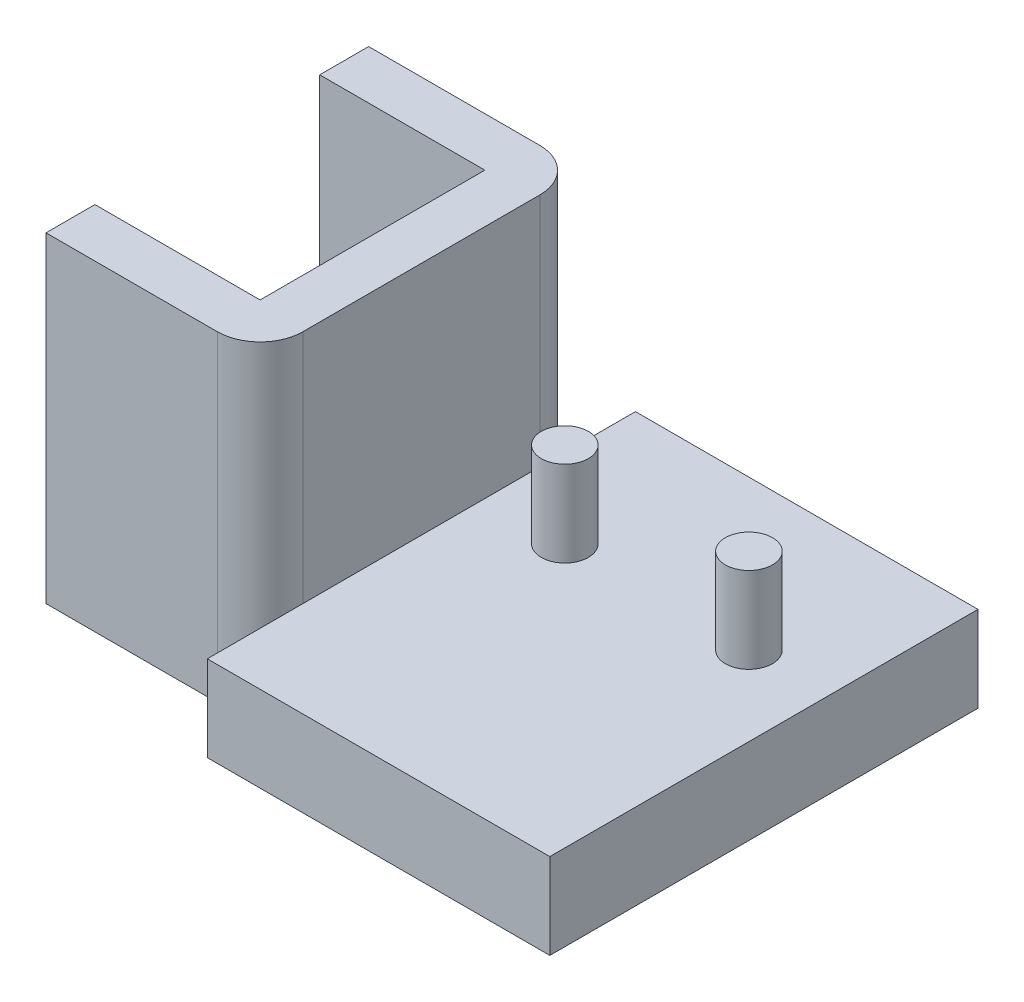
ISO-10303-21;
HEADER;
FILE_DESCRIPTION(('STEP AP214'),'2;1');
FILE_NAME('part.step','',(''),(''),'','','');
FILE_SCHEMA(('AUTOMOTIVE_DESIGN { 1 0 10303 214 1 1 1 1 }'));
ENDSEC;
DATA;
#1=APPLICATION_CONTEXT('core data for automotive mechanical design processes');
#2=APPLICATION_PROTOCOL_DEFINITION('international standard','automotive_design',2000,#1);
#3=PRODUCT_CONTEXT('',#1,'mechanical');
#4=PRODUCT('Part','Part','',(#3));
#5=PRODUCT_RELATED_PRODUCT_CATEGORY('part','',(#4));
#6=PRODUCT_DEFINITION_FORMATION('','',#4);
#7=PRODUCT_DEFINITION_CONTEXT('part definition',#1,'design');
#8=PRODUCT_DEFINITION('design','',#6,#7);
#9=PRODUCT_DEFINITION_SHAPE('','',#8);
#10=(LENGTH_UNIT() NAMED_UNIT(*) SI_UNIT(.MILLI.,.METRE.));
#11=(NAMED_UNIT(*) PLANE_ANGLE_UNIT() SI_UNIT($,.RADIAN.));
#12=(NAMED_UNIT(*) SI_UNIT($,.STERADIAN.) SOLID_ANGLE_UNIT());
#13=UNCERTAINTY_MEASURE_WITH_UNIT(LENGTH_MEASURE(1.E-05),#10,'distance_accuracy_value','');
#14=(GEOMETRIC_REPRESENTATION_CONTEXT(3) GLOBAL_UNCERTAINTY_ASSIGNED_CONTEXT((#13)) GLOBAL_UNIT_ASSIGNED_CONTEXT((#10,
#11,#12)) REPRESENTATION_CONTEXT('',''));
#15=CARTESIAN_POINT('',(0.,0.,0.));
#16=DIRECTION('',(0.,0.,1.));
#17=DIRECTION('',(1.,0.,0.));
#18=AXIS2_PLACEMENT_3D('',#15,#16,#17);
#19=CARTESIAN_POINT('',(3.61645179689281,15.,0.));
#20=DIRECTION('',(-1.,0.,0.));
#21=DIRECTION('',(0.,0.,1.));
#22=AXIS2_PLACEMENT_3D('',#19,#20,#21);
#23=PLANE('',#22);
#24=DIRECTION('',(0.,-1.,0.));
#25=VECTOR('',#24,1.);
#26=CARTESIAN_POINT('',(3.61645179689281,15.,1.20931638920193));
#27=LINE('',#26,#25);
#28=CARTESIAN_POINT('',(3.61645179689281,15.,1.20931638920193));
#29=VERTEX_POINT('',#28);
#30=CARTESIAN_POINT('',(3.61645179689281,4.,1.20931638920193));
#31=VERTEX_POINT('',#30);
#32=EDGE_CURVE('E220',#29,#31,#27,.T.);
#33=ORIENTED_EDGE('',*,*,#32,.T.);
#34=DIRECTION('',(0.,0.,1.));
#35=VECTOR('',#34,1.);
#36=CARTESIAN_POINT('',(3.61645179689282,4.,0.));
#37=LINE('',#36,#35);
#38=CARTESIAN_POINT('',(3.61645179689281,4.,-9.86068361079804));
#39=VERTEX_POINT('',#38);
#40=EDGE_CURVE('E55',#39,#31,#37,.T.);
#41=ORIENTED_EDGE('',*,*,#40,.F.);
#42=DIRECTION('',(0.,-1.,0.));
#43=VECTOR('',#42,1.);
#44=CARTESIAN_POINT('',(3.61645179689281,15.,-9.86068361079804));
#45=LINE('',#44,#43);
#46=CARTESIAN_POINT('',(3.61645179689281,15.,-9.86068361079804));
#47=VERTEX_POINT('',#46);
#48=EDGE_CURVE('E11',#47,#39,#45,.T.);
#49=ORIENTED_EDGE('',*,*,#48,.F.);
#50=DIRECTION('',(0.,0.,-1.));
#51=VECTOR('',#50,1.);
#52=CARTESIAN_POINT('',(3.61645179689281,15.,0.));
#53=LINE('',#52,#51);
#54=EDGE_CURVE('E190',#29,#47,#53,.T.);
#55=ORIENTED_EDGE('',*,*,#54,.F.);
#56=EDGE_LOOP('',(#33,#41,#49,#55));
#57=FACE_BOUND('',#56,.T.);
#58=ADVANCED_FACE('F40',(#57),#23,.F.);
#59=CARTESIAN_POINT('',(1.61645179689281,15.,-9.86068361079806));
#60=DIRECTION('',(0.,-1.,0.));
#61=DIRECTION('',(0.,0.,-1.));
#62=AXIS2_PLACEMENT_3D('',#59,#60,#61);
#63=CYLINDRICAL_SURFACE('',#62,2.);
#64=CARTESIAN_POINT('',(1.61645179689281,0.,-9.86068361079806));
#65=DIRECTION('',(0.,1.,0.));
#66=DIRECTION('',(0.,0.,1.));
#67=AXIS2_PLACEMENT_3D('',#64,#65,#66);
#68=CIRCLE('',#67,2.);
#69=CARTESIAN_POINT('',(3.61645179689282,0.,-9.86068361079804));
#70=VERTEX_POINT('',#69);
#71=CARTESIAN_POINT('',(1.6164517968928,0.,-11.8606836107981));
#72=VERTEX_POINT('',#71);
#73=EDGE_CURVE('E189',#70,#72,#68,.T.);
#74=ORIENTED_EDGE('',*,*,#73,.T.);
#75=DIRECTION('',(0.,-1.,0.));
#76=VECTOR('',#75,1.);
#77=CARTESIAN_POINT('',(1.6164517968928,15.,-11.8606836107981));
#78=LINE('',#77,#76);
#79=CARTESIAN_POINT('',(1.6164517968928,15.,-11.8606836107981));
#80=VERTEX_POINT('',#79);
#81=EDGE_CURVE('E48',#80,#72,#78,.T.);
#82=ORIENTED_EDGE('',*,*,#81,.F.);
#83=CARTESIAN_POINT('',(1.61645179689281,15.,-9.86068361079806));
#84=DIRECTION('',(0.,1.,0.));
#85=DIRECTION('',(0.,0.,1.));
#86=AXIS2_PLACEMENT_3D('',#83,#84,#85);
#87=CIRCLE('',#86,2.);
#88=EDGE_CURVE('E194',#47,#80,#87,.T.);
#89=ORIENTED_EDGE('',*,*,#88,.F.);
#90=ORIENTED_EDGE('',*,*,#48,.T.);
#91=DIRECTION('',(0.,-1.,0.));
#92=VECTOR('',#91,1.);
#93=CARTESIAN_POINT('',(3.61645179689281,15.,-9.86068361079806));
#94=LINE('',#93,#92);
#95=EDGE_CURVE('E180',#39,#70,#94,.T.);
#96=ORIENTED_EDGE('',*,*,#95,.T.);
#97=EDGE_LOOP('',(#74,#82,#89,#90,#96));
#98=FACE_BOUND('',#97,.T.);
#99=ADVANCED_FACE('F301',(#98),#63,.T.);
#100=CARTESIAN_POINT('',(0.,15.,-11.8606836107981));
#101=DIRECTION('',(0.,0.,1.));
#102=DIRECTION('',(1.,0.,0.));
#103=AXIS2_PLACEMENT_3D('',#100,#101,#102);
#104=PLANE('',#103);
#105=DIRECTION('',(-1.,0.,0.));
#106=VECTOR('',#105,1.);
#107=CARTESIAN_POINT('',(0.,0.,-11.8606836107981));
#108=LINE('',#107,#106);
#109=CARTESIAN_POINT('',(-6.38354820310719,0.,-11.8606836107981));
#110=VERTEX_POINT('',#109);
#111=EDGE_CURVE('E223',#72,#110,#108,.T.);
#112=ORIENTED_EDGE('',*,*,#111,.T.);
#113=DIRECTION('',(0.,-1.,0.));
#114=VECTOR('',#113,1.);
#115=CARTESIAN_POINT('',(-6.38354820310719,15.,-11.8606836107981));
#116=LINE('',#115,#114);
#117=CARTESIAN_POINT('',(-6.38354820310719,15.,-11.8606836107981));
#118=VERTEX_POINT('',#117);
#119=EDGE_CURVE('E270',#118,#110,#116,.T.);
#120=ORIENTED_EDGE('',*,*,#119,.F.);
#121=DIRECTION('',(-1.,0.,0.));
#122=VECTOR('',#121,1.);
#123=CARTESIAN_POINT('',(0.,15.,-11.8606836107981));
#124=LINE('',#123,#122);
#125=EDGE_CURVE('E198',#80,#118,#124,.T.);
#126=ORIENTED_EDGE('',*,*,#125,.F.);
#127=ORIENTED_EDGE('',*,*,#81,.T.);
#128=EDGE_LOOP('',(#112,#120,#126,#127));
#129=FACE_BOUND('',#128,.T.);
#130=ADVANCED_FACE('F279',(#129),#104,.F.);
#131=CARTESIAN_POINT('',(-6.38354820310719,15.,0.));
#132=DIRECTION('',(1.,0.,0.));
#133=DIRECTION('',(0.,0.,-1.));
#134=AXIS2_PLACEMENT_3D('',#131,#132,#133);
#135=PLANE('',#134);
#136=DIRECTION('',(0.,0.,1.));
#137=VECTOR('',#136,1.);
#138=CARTESIAN_POINT('',(-6.38354820310719,0.,0.));
#139=LINE('',#138,#137);
#140=CARTESIAN_POINT('',(-6.38354820310719,0.,-9.57568361079805));
#141=VERTEX_POINT('',#140);
#142=EDGE_CURVE('E226',#110,#141,#139,.T.);
#143=ORIENTED_EDGE('',*,*,#142,.T.);
#144=DIRECTION('',(0.,-1.,0.));
#145=VECTOR('',#144,1.);
#146=CARTESIAN_POINT('',(-6.38354820310719,15.,-9.57568361079805));
#147=LINE('',#146,#145);
#148=CARTESIAN_POINT('',(-6.38354820310719,15.,-9.57568361079805));
#149=VERTEX_POINT('',#148);
#150=EDGE_CURVE('E266',#149,#141,#147,.T.);
#151=ORIENTED_EDGE('',*,*,#150,.F.);
#152=DIRECTION('',(0.,0.,1.));
#153=VECTOR('',#152,1.);
#154=CARTESIAN_POINT('',(-6.38354820310719,15.,0.));
#155=LINE('',#154,#153);
#156=EDGE_CURVE('E201',#118,#149,#155,.T.);
#157=ORIENTED_EDGE('',*,*,#156,.F.);
#158=ORIENTED_EDGE('',*,*,#119,.T.);
#159=EDGE_LOOP('',(#143,#151,#157,#158));
#160=FACE_BOUND('',#159,.T.);
#161=ADVANCED_FACE('F290',(#160),#135,.F.);
#162=CARTESIAN_POINT('',(0.,15.,-9.57568361079805));
#163=DIRECTION('',(0.,0.,-1.));
#164=DIRECTION('',(-1.,0.,0.));
#165=AXIS2_PLACEMENT_3D('',#162,#163,#164);
#166=PLANE('',#165);
#167=DIRECTION('',(1.,0.,0.));
#168=VECTOR('',#167,1.);
#169=CARTESIAN_POINT('',(0.,0.,-9.57568361079805));
#170=LINE('',#169,#168);
#171=CARTESIAN_POINT('',(1.3314517968928,0.,-9.57568361079805));
#172=VERTEX_POINT('',#171);
#173=EDGE_CURVE('E229',#141,#172,#170,.T.);
#174=ORIENTED_EDGE('',*,*,#173,.T.);
#175=DIRECTION('',(0.,-1.,0.));
#176=VECTOR('',#175,1.);
#177=CARTESIAN_POINT('',(1.3314517968928,15.,-9.57568361079805));
#178=LINE('',#177,#176);
#179=CARTESIAN_POINT('',(1.3314517968928,15.,-9.57568361079805));
#180=VERTEX_POINT('',#179);
#181=EDGE_CURVE('E262',#180,#172,#178,.T.);
#182=ORIENTED_EDGE('',*,*,#181,.F.);
#183=DIRECTION('',(1.,0.,0.));
#184=VECTOR('',#183,1.);
#185=CARTESIAN_POINT('',(0.,15.,-9.57568361079805));
#186=LINE('',#185,#184);
#187=EDGE_CURVE('E204',#149,#180,#186,.T.);
#188=ORIENTED_EDGE('',*,*,#187,.F.);
#189=ORIENTED_EDGE('',*,*,#150,.T.);
#190=EDGE_LOOP('',(#174,#182,#188,#189));
#191=FACE_BOUND('',#190,.T.);
#192=ADVANCED_FACE('F294',(#191),#166,.F.);
#193=CARTESIAN_POINT('',(1.3314517968928,15.,0.));
#194=DIRECTION('',(1.,0.,0.));
#195=DIRECTION('',(0.,0.,-1.));
#196=AXIS2_PLACEMENT_3D('',#193,#194,#195);
#197=PLANE('',#196);
#198=DIRECTION('',(0.,0.,1.));
#199=VECTOR('',#198,1.);
#200=CARTESIAN_POINT('',(1.3314517968928,0.,0.));
#201=LINE('',#200,#199);
#202=CARTESIAN_POINT('',(1.3314517968928,0.,0.924316389201944));
#203=VERTEX_POINT('',#202);
#204=EDGE_CURVE('E233',#172,#203,#201,.T.);
#205=ORIENTED_EDGE('',*,*,#204,.T.);
#206=DIRECTION('',(0.,-1.,0.));
#207=VECTOR('',#206,1.);
#208=CARTESIAN_POINT('',(1.3314517968928,15.,0.924316389201944));
#209=LINE('',#208,#207);
#210=CARTESIAN_POINT('',(1.3314517968928,15.,0.924316389201944));
#211=VERTEX_POINT('',#210);
#212=EDGE_CURVE('E258',#211,#203,#209,.T.);
#213=ORIENTED_EDGE('',*,*,#212,.F.);
#214=DIRECTION('',(0.,0.,1.));
#215=VECTOR('',#214,1.);
#216=CARTESIAN_POINT('',(1.3314517968928,15.,0.));
#217=LINE('',#216,#215);
#218=EDGE_CURVE('E208',#180,#211,#217,.T.);
#219=ORIENTED_EDGE('',*,*,#218,.F.);
#220=ORIENTED_EDGE('',*,*,#181,.T.);
#221=EDGE_LOOP('',(#205,#213,#219,#220));
#222=FACE_BOUND('',#221,.T.);
#223=ADVANCED_FACE('F405',(#222),#197,.F.);
#224=CARTESIAN_POINT('',(0.,15.,0.924316389201944));
#225=DIRECTION('',(0.,0.,1.));
#226=DIRECTION('',(1.,0.,0.));
#227=AXIS2_PLACEMENT_3D('',#224,#225,#226);
#228=PLANE('',#227);
#229=DIRECTION('',(-1.,0.,0.));
#230=VECTOR('',#229,1.);
#231=CARTESIAN_POINT('',(0.,0.,0.924316389201944));
#232=LINE('',#231,#230);
#233=CARTESIAN_POINT('',(-6.38354820310719,0.,0.924316389201945));
#234=VERTEX_POINT('',#233);
#235=EDGE_CURVE('E236',#203,#234,#232,.T.);
#236=ORIENTED_EDGE('',*,*,#235,.T.);
#237=DIRECTION('',(0.,-1.,0.));
#238=VECTOR('',#237,1.);
#239=CARTESIAN_POINT('',(-6.38354820310719,15.,0.924316389201945));
#240=LINE('',#239,#238);
#241=CARTESIAN_POINT('',(-6.38354820310719,15.,0.924316389201945));
#242=VERTEX_POINT('',#241);
#243=EDGE_CURVE('E254',#242,#234,#240,.T.);
#244=ORIENTED_EDGE('',*,*,#243,.F.);
#245=DIRECTION('',(-1.,0.,0.));
#246=VECTOR('',#245,1.);
#247=CARTESIAN_POINT('',(0.,15.,0.924316389201944));
#248=LINE('',#247,#246);
#249=EDGE_CURVE('E211',#211,#242,#248,.T.);
#250=ORIENTED_EDGE('',*,*,#249,.F.);
#251=ORIENTED_EDGE('',*,*,#212,.T.);
#252=EDGE_LOOP('',(#236,#244,#250,#251));
#253=FACE_BOUND('',#252,.T.);
#254=ADVANCED_FACE('F403',(#253),#228,.F.);
#255=CARTESIAN_POINT('',(-6.38354820310719,0.,3.20931638920194));
#256=VERTEX_POINT('',#255);
#257=EDGE_CURVE('E230',#234,#256,#139,.T.);
#258=ORIENTED_EDGE('',*,*,#257,.T.);
#259=DIRECTION('',(0.,-1.,0.));
#260=VECTOR('',#259,1.);
#261=CARTESIAN_POINT('',(-6.38354820310719,15.,3.20931638920194));
#262=LINE('',#261,#260);
#263=CARTESIAN_POINT('',(-6.38354820310719,15.,3.20931638920194));
#264=VERTEX_POINT('',#263);
#265=EDGE_CURVE('E250',#264,#256,#262,.T.);
#266=ORIENTED_EDGE('',*,*,#265,.F.);
#267=EDGE_CURVE('E205',#242,#264,#155,.T.);
#268=ORIENTED_EDGE('',*,*,#267,.F.);
#269=ORIENTED_EDGE('',*,*,#243,.T.);
#270=EDGE_LOOP('',(#258,#266,#268,#269));
#271=FACE_BOUND('',#270,.T.);
#272=ADVANCED_FACE('F399',(#271),#135,.F.);
#273=CARTESIAN_POINT('',(0.,15.,3.20931638920194));
#274=DIRECTION('',(0.,0.,-1.));
#275=DIRECTION('',(-1.,0.,0.));
#276=AXIS2_PLACEMENT_3D('',#273,#274,#275);
#277=PLANE('',#276);
#278=DIRECTION('',(1.,0.,0.));
#279=VECTOR('',#278,1.);
#280=CARTESIAN_POINT('',(0.,0.,3.20931638920194));
#281=LINE('',#280,#279);
#282=CARTESIAN_POINT('',(1.6164517968928,0.,3.20931638920194));
#283=VERTEX_POINT('',#282);
#284=EDGE_CURVE('E239',#256,#283,#281,.T.);
#285=ORIENTED_EDGE('',*,*,#284,.T.);
#286=DIRECTION('',(0.,-1.,0.));
#287=VECTOR('',#286,1.);
#288=CARTESIAN_POINT('',(1.6164517968928,15.,3.20931638920194));
#289=LINE('',#288,#287);
#290=CARTESIAN_POINT('',(1.6164517968928,15.,3.20931638920194));
#291=VERTEX_POINT('',#290);
#292=EDGE_CURVE('E246',#291,#283,#289,.T.);
#293=ORIENTED_EDGE('',*,*,#292,.F.);
#294=DIRECTION('',(1.,0.,0.));
#295=VECTOR('',#294,1.);
#296=CARTESIAN_POINT('',(0.,15.,3.20931638920194));
#297=LINE('',#296,#295);
#298=EDGE_CURVE('E214',#264,#291,#297,.T.);
#299=ORIENTED_EDGE('',*,*,#298,.F.);
#300=ORIENTED_EDGE('',*,*,#265,.T.);
#301=EDGE_LOOP('',(#285,#293,#299,#300));
#302=FACE_BOUND('',#301,.T.);
#303=ADVANCED_FACE('F391',(#302),#277,.F.);
#304=CARTESIAN_POINT('',(1.61645179689281,15.,1.20931638920194));
#305=DIRECTION('',(0.,-1.,0.));
#306=DIRECTION('',(0.,0.,-1.));
#307=AXIS2_PLACEMENT_3D('',#304,#305,#306);
#308=CYLINDRICAL_SURFACE('',#307,2.);
#309=CARTESIAN_POINT('',(1.61645179689281,0.,1.20931638920194));
#310=DIRECTION('',(0.,1.,0.));
#311=DIRECTION('',(0.,0.,1.));
#312=AXIS2_PLACEMENT_3D('',#309,#310,#311);
#313=CIRCLE('',#312,2.);
#314=CARTESIAN_POINT('',(3.61645179689281,0.,1.20931638920193));
#315=VERTEX_POINT('',#314);
#316=EDGE_CURVE('E195',#283,#315,#313,.T.);
#317=ORIENTED_EDGE('',*,*,#316,.T.);
#318=DIRECTION('',(0.,-1.,0.));
#319=VECTOR('',#318,1.);
#320=CARTESIAN_POINT('',(3.61645179689281,15.,1.20931638920194));
#321=LINE('',#320,#319);
#322=EDGE_CURVE('E62',#31,#315,#321,.T.);
#323=ORIENTED_EDGE('',*,*,#322,.F.);
#324=ORIENTED_EDGE('',*,*,#32,.F.);
#325=CARTESIAN_POINT('',(1.61645179689281,15.,1.20931638920194));
#326=DIRECTION('',(0.,1.,0.));
#327=DIRECTION('',(0.,0.,1.));
#328=AXIS2_PLACEMENT_3D('',#325,#326,#327);
#329=CIRCLE('',#328,2.);
#330=EDGE_CURVE('E217',#291,#29,#329,.T.);
#331=ORIENTED_EDGE('',*,*,#330,.F.);
#332=ORIENTED_EDGE('',*,*,#292,.T.);
#333=EDGE_LOOP('',(#317,#323,#324,#331,#332));
#334=FACE_BOUND('',#333,.T.);
#335=ADVANCED_FACE('F384',(#334),#308,.T.);
#336=CARTESIAN_POINT('',(0.,15.,0.));
#337=DIRECTION('',(0.,1.,0.));
#338=DIRECTION('',(0.,0.,1.));
#339=AXIS2_PLACEMENT_3D('',#336,#337,#338);
#340=PLANE('',#339);
#341=ORIENTED_EDGE('',*,*,#54,.T.);
#342=ORIENTED_EDGE('',*,*,#88,.T.);
#343=ORIENTED_EDGE('',*,*,#125,.T.);
#344=ORIENTED_EDGE('',*,*,#156,.T.);
#345=ORIENTED_EDGE('',*,*,#187,.T.);
#346=ORIENTED_EDGE('',*,*,#218,.T.);
#347=ORIENTED_EDGE('',*,*,#249,.T.);
#348=ORIENTED_EDGE('',*,*,#267,.T.);
#349=ORIENTED_EDGE('',*,*,#298,.T.);
#350=ORIENTED_EDGE('',*,*,#330,.T.);
#351=EDGE_LOOP('',(#341,#342,#343,#344,#345,#346,#347,#348,#349,#350));
#352=FACE_BOUND('',#351,.T.);
#353=ADVANCED_FACE('F298',(#352),#340,.T.);
#354=CARTESIAN_POINT('',(0.,0.,0.));
#355=DIRECTION('',(0.,1.,0.));
#356=DIRECTION('',(0.,0.,1.));
#357=AXIS2_PLACEMENT_3D('',#354,#355,#356);
#358=PLANE('',#357);
#359=ORIENTED_EDGE('',*,*,#73,.F.);
#360=DIRECTION('',(0.,0.,1.));
#361=VECTOR('',#360,1.);
#362=CARTESIAN_POINT('',(3.61645179689282,0.,0.));
#363=LINE('',#362,#361);
#364=CARTESIAN_POINT('',(3.61645179689282,0.,-14.3256836107981));
#365=VERTEX_POINT('',#364);
#366=EDGE_CURVE('E307',#365,#70,#363,.T.);
#367=ORIENTED_EDGE('',*,*,#366,.F.);
#368=DIRECTION('',(-1.,0.,0.));
#369=VECTOR('',#368,1.);
#370=CARTESIAN_POINT('',(0.,0.,-14.3256836107981));
#371=LINE('',#370,#369);
#372=CARTESIAN_POINT('',(19.6164517968928,0.,-14.3256836107981));
#373=VERTEX_POINT('',#372);
#374=EDGE_CURVE('E333',#373,#365,#371,.T.);
#375=ORIENTED_EDGE('',*,*,#374,.F.);
#376=DIRECTION('',(0.,0.,-1.));
#377=VECTOR('',#376,1.);
#378=CARTESIAN_POINT('',(19.6164517968928,0.,0.));
#379=LINE('',#378,#377);
#380=CARTESIAN_POINT('',(19.6164517968928,0.,5.67431638920194));
#381=VERTEX_POINT('',#380);
#382=EDGE_CURVE('E175',#381,#373,#379,.T.);
#383=ORIENTED_EDGE('',*,*,#382,.F.);
#384=DIRECTION('',(1.,0.,0.));
#385=VECTOR('',#384,1.);
#386=CARTESIAN_POINT('',(0.,0.,5.67431638920194));
#387=LINE('',#386,#385);
#388=CARTESIAN_POINT('',(3.61645179689282,0.,5.67431638920194));
#389=VERTEX_POINT('',#388);
#390=EDGE_CURVE('E171',#389,#381,#387,.T.);
#391=ORIENTED_EDGE('',*,*,#390,.F.);
#392=EDGE_CURVE('E321',#315,#389,#363,.T.);
#393=ORIENTED_EDGE('',*,*,#392,.F.);
#394=ORIENTED_EDGE('',*,*,#316,.F.);
#395=ORIENTED_EDGE('',*,*,#284,.F.);
#396=ORIENTED_EDGE('',*,*,#257,.F.);
#397=ORIENTED_EDGE('',*,*,#235,.F.);
#398=ORIENTED_EDGE('',*,*,#204,.F.);
#399=ORIENTED_EDGE('',*,*,#173,.F.);
#400=ORIENTED_EDGE('',*,*,#142,.F.);
#401=ORIENTED_EDGE('',*,*,#111,.F.);
#402=EDGE_LOOP('',(#359,#367,#375,#383,#391,#393,#394,#395,#396,#397,#398,#399,#400,#401));
#403=FACE_BOUND('',#402,.T.);
#404=ADVANCED_FACE('F284',(#403),#358,.F.);
#405=CARTESIAN_POINT('',(3.61645179689282,4.,0.));
#406=DIRECTION('',(1.,0.,0.));
#407=DIRECTION('',(0.,0.,-1.));
#408=AXIS2_PLACEMENT_3D('',#405,#406,#407);
#409=PLANE('',#408);
#410=CARTESIAN_POINT('',(3.61645179689282,4.,5.67431638920194));
#411=VERTEX_POINT('',#410);
#412=EDGE_CURVE('E160',#31,#411,#37,.T.);
#413=ORIENTED_EDGE('',*,*,#412,.F.);
#414=ORIENTED_EDGE('',*,*,#322,.T.);
#415=ORIENTED_EDGE('',*,*,#392,.T.);
#416=DIRECTION('',(0.,-1.,0.));
#417=VECTOR('',#416,1.);
#418=CARTESIAN_POINT('',(3.61645179689282,4.,5.67431638920194));
#419=LINE('',#418,#417);
#420=EDGE_CURVE('E182',#411,#389,#419,.T.);
#421=ORIENTED_EDGE('',*,*,#420,.F.);
#422=EDGE_LOOP('',(#413,#414,#415,#421));
#423=FACE_BOUND('',#422,.T.);
#424=ADVANCED_FACE('F319',(#423),#409,.F.);
#425=CARTESIAN_POINT('',(19.6164517968928,4.,0.));
#426=DIRECTION('',(-1.,0.,0.));
#427=DIRECTION('',(0.,0.,1.));
#428=AXIS2_PLACEMENT_3D('',#425,#426,#427);
#429=PLANE('',#428);
#430=ORIENTED_EDGE('',*,*,#382,.T.);
#431=DIRECTION('',(0.,-1.,0.));
#432=VECTOR('',#431,1.);
#433=CARTESIAN_POINT('',(19.6164517968928,4.,-14.3256836107981));
#434=LINE('',#433,#432);
#435=CARTESIAN_POINT('',(19.6164517968928,4.,-14.3256836107981));
#436=VERTEX_POINT('',#435);
#437=EDGE_CURVE('E152',#436,#373,#434,.T.);
#438=ORIENTED_EDGE('',*,*,#437,.F.);
#439=DIRECTION('',(0.,0.,-1.));
#440=VECTOR('',#439,1.);
#441=CARTESIAN_POINT('',(19.6164517968928,4.,0.));
#442=LINE('',#441,#440);
#443=CARTESIAN_POINT('',(19.6164517968928,4.,5.67431638920194));
#444=VERTEX_POINT('',#443);
#445=EDGE_CURVE('E161',#444,#436,#442,.T.);
#446=ORIENTED_EDGE('',*,*,#445,.F.);
#447=DIRECTION('',(0.,-1.,0.));
#448=VECTOR('',#447,1.);
#449=CARTESIAN_POINT('',(19.6164517968928,4.,5.67431638920194));
#450=LINE('',#449,#448);
#451=EDGE_CURVE('E312',#444,#381,#450,.T.);
#452=ORIENTED_EDGE('',*,*,#451,.T.);
#453=EDGE_LOOP('',(#430,#438,#446,#452));
#454=FACE_BOUND('',#453,.T.);
#455=ADVANCED_FACE('F173',(#454),#429,.F.);
#456=CARTESIAN_POINT('',(0.,4.,-14.3256836107981));
#457=DIRECTION('',(0.,0.,1.));
#458=DIRECTION('',(1.,0.,0.));
#459=AXIS2_PLACEMENT_3D('',#456,#457,#458);
#460=PLANE('',#459);
#461=ORIENTED_EDGE('',*,*,#374,.T.);
#462=DIRECTION('',(0.,-1.,0.));
#463=VECTOR('',#462,1.);
#464=CARTESIAN_POINT('',(3.61645179689282,4.,-14.3256836107981));
#465=LINE('',#464,#463);
#466=CARTESIAN_POINT('',(3.61645179689282,4.,-14.3256836107981));
#467=VERTEX_POINT('',#466);
#468=EDGE_CURVE('E155',#467,#365,#465,.T.);
#469=ORIENTED_EDGE('',*,*,#468,.F.);
#470=DIRECTION('',(-1.,0.,0.));
#471=VECTOR('',#470,1.);
#472=CARTESIAN_POINT('',(0.,4.,-14.3256836107981));
#473=LINE('',#472,#471);
#474=EDGE_CURVE('E148',#436,#467,#473,.T.);
#475=ORIENTED_EDGE('',*,*,#474,.F.);
#476=ORIENTED_EDGE('',*,*,#437,.T.);
#477=EDGE_LOOP('',(#461,#469,#475,#476));
#478=FACE_BOUND('',#477,.T.);
#479=ADVANCED_FACE('F150',(#478),#460,.F.);
#480=ORIENTED_EDGE('',*,*,#95,.F.);
#481=EDGE_CURVE('E306',#467,#39,#37,.T.);
#482=ORIENTED_EDGE('',*,*,#481,.F.);
#483=ORIENTED_EDGE('',*,*,#468,.T.);
#484=ORIENTED_EDGE('',*,*,#366,.T.);
#485=EDGE_LOOP('',(#480,#482,#483,#484));
#486=FACE_BOUND('',#485,.T.);
#487=ADVANCED_FACE('F305',(#486),#409,.F.);
#488=CARTESIAN_POINT('',(0.,4.,5.67431638920194));
#489=DIRECTION('',(0.,0.,-1.));
#490=DIRECTION('',(-1.,0.,0.));
#491=AXIS2_PLACEMENT_3D('',#488,#489,#490);
#492=PLANE('',#491);
#493=ORIENTED_EDGE('',*,*,#390,.T.);
#494=ORIENTED_EDGE('',*,*,#451,.F.);
#495=DIRECTION('',(1.,0.,0.));
#496=VECTOR('',#495,1.);
#497=CARTESIAN_POINT('',(0.,4.,5.67431638920194));
#498=LINE('',#497,#496);
#499=EDGE_CURVE('E166',#411,#444,#498,.T.);
#500=ORIENTED_EDGE('',*,*,#499,.F.);
#501=ORIENTED_EDGE('',*,*,#420,.T.);
#502=EDGE_LOOP('',(#493,#494,#500,#501));
#503=FACE_BOUND('',#502,.T.);
#504=ADVANCED_FACE('F325',(#503),#492,.F.);
#505=CARTESIAN_POINT('',(0.,4.,0.));
#506=DIRECTION('',(0.,1.,0.));
#507=DIRECTION('',(0.,0.,1.));
#508=AXIS2_PLACEMENT_3D('',#505,#506,#507);
#509=PLANE('',#508);
#510=CARTESIAN_POINT('',(15.9164517968928,4.,-7.32568361079806));
#511=DIRECTION('',(0.,1.,0.));
#512=DIRECTION('',(0.,0.,1.));
#513=AXIS2_PLACEMENT_3D('',#510,#511,#512);
#514=CIRCLE('',#513,1.1);
#515=CARTESIAN_POINT('',(15.9164517968928,4.,-6.22568361079806));
#516=VERTEX_POINT('',#515);
#517=EDGE_CURVE('E349',#516,#516,#514,.T.);
#518=ORIENTED_EDGE('',*,*,#517,.F.);
#519=EDGE_LOOP('',(#518));
#520=FACE_BOUND('',#519,.T.);
#521=CARTESIAN_POINT('',(7.31645179689282,4.,-7.32568361079806));
#522=DIRECTION('',(0.,1.,0.));
#523=DIRECTION('',(0.,0.,1.));
#524=AXIS2_PLACEMENT_3D('',#521,#522,#523);
#525=CIRCLE('',#524,1.1);
#526=CARTESIAN_POINT('',(7.31645179689282,4.,-6.22568361079806));
#527=VERTEX_POINT('',#526);
#528=EDGE_CURVE('E340',#527,#527,#525,.T.);
#529=ORIENTED_EDGE('',*,*,#528,.F.);
#530=EDGE_LOOP('',(#529));
#531=FACE_BOUND('',#530,.T.);
#532=ORIENTED_EDGE('',*,*,#445,.T.);
#533=ORIENTED_EDGE('',*,*,#474,.T.);
#534=ORIENTED_EDGE('',*,*,#481,.T.);
#535=ORIENTED_EDGE('',*,*,#40,.T.);
#536=ORIENTED_EDGE('',*,*,#412,.T.);
#537=ORIENTED_EDGE('',*,*,#499,.T.);
#538=EDGE_LOOP('',(#532,#533,#534,#535,#536,#537));
#539=FACE_BOUND('',#538,.T.);
#540=ADVANCED_FACE('F164',(#520,#531,#539),#509,.T.);
#541=CARTESIAN_POINT('',(7.31645179689282,8.,-7.32568361079806));
#542=DIRECTION('',(0.,-1.,0.));
#543=DIRECTION('',(0.,0.,-1.));
#544=AXIS2_PLACEMENT_3D('',#541,#542,#543);
#545=CYLINDRICAL_SURFACE('',#544,1.1);
#546=CARTESIAN_POINT('',(7.31645179689282,8.,-7.32568361079806));
#547=DIRECTION('',(0.,1.,0.));
#548=DIRECTION('',(0.,0.,1.));
#549=AXIS2_PLACEMENT_3D('',#546,#547,#548);
#550=CIRCLE('',#549,1.1);
#551=CARTESIAN_POINT('',(7.31645179689282,8.,-6.22568361079806));
#552=VERTEX_POINT('',#551);
#553=EDGE_CURVE('E337',#552,#552,#550,.T.);
#554=ORIENTED_EDGE('',*,*,#553,.F.);
#555=EDGE_LOOP('',(#554));
#556=FACE_BOUND('',#555,.T.);
#557=ORIENTED_EDGE('',*,*,#528,.T.);
#558=EDGE_LOOP('',(#557));
#559=FACE_BOUND('',#558,.T.);
#560=ADVANCED_FACE('F368',(#556,#559),#545,.T.);
#561=CARTESIAN_POINT('',(7.31645179689282,8.,-7.32568361079806));
#562=DIRECTION('',(0.,1.,0.));
#563=DIRECTION('',(0.,0.,1.));
#564=AXIS2_PLACEMENT_3D('',#561,#562,#563);
#565=PLANE('',#564);
#566=ORIENTED_EDGE('',*,*,#553,.T.);
#567=EDGE_LOOP('',(#566));
#568=FACE_BOUND('',#567,.T.);
#569=ADVANCED_FACE('F362',(#568),#565,.T.);
#570=CARTESIAN_POINT('',(15.9164517968928,8.,-7.32568361079806));
#571=DIRECTION('',(0.,-1.,0.));
#572=DIRECTION('',(0.,0.,-1.));
#573=AXIS2_PLACEMENT_3D('',#570,#571,#572);
#574=CYLINDRICAL_SURFACE('',#573,1.1);
#575=CARTESIAN_POINT('',(15.9164517968928,8.,-7.32568361079806));
#576=DIRECTION('',(0.,1.,0.));
#577=DIRECTION('',(0.,0.,1.));
#578=AXIS2_PLACEMENT_3D('',#575,#576,#577);
#579=CIRCLE('',#578,1.1);
#580=CARTESIAN_POINT('',(15.9164517968928,8.,-6.22568361079806));
#581=VERTEX_POINT('',#580);
#582=EDGE_CURVE('E346',#581,#581,#579,.T.);
#583=ORIENTED_EDGE('',*,*,#582,.F.);
#584=EDGE_LOOP('',(#583));
#585=FACE_BOUND('',#584,.T.);
#586=ORIENTED_EDGE('',*,*,#517,.T.);
#587=EDGE_LOOP('',(#586));
#588=FACE_BOUND('',#587,.T.);
#589=ADVANCED_FACE('F359',(#585,#588),#574,.T.);
#590=CARTESIAN_POINT('',(15.9164517968928,8.,-7.32568361079806));
#591=DIRECTION('',(0.,1.,0.));
#592=DIRECTION('',(0.,0.,1.));
#593=AXIS2_PLACEMENT_3D('',#590,#591,#592);
#594=PLANE('',#593);
#595=ORIENTED_EDGE('',*,*,#582,.T.);
#596=EDGE_LOOP('',(#595));
#597=FACE_BOUND('',#596,.T.);
#598=ADVANCED_FACE('F357',(#597),#594,.T.);
#599=CLOSED_SHELL('',(#58,#99,#130,#161,#192,#223,#254,#272,#303,#335,#353,#404,#424,#455,#479,
#487,#504,#540,#560,#569,#589,#598));
#600=MANIFOLD_SOLID_BREP('B2',#599);
#601=ADVANCED_BREP_SHAPE_REPRESENTATION('',(#18,#600),#14);
#602=SHAPE_DEFINITION_REPRESENTATION(#9,#601);
ENDSEC;
END-ISO-10303-21;
